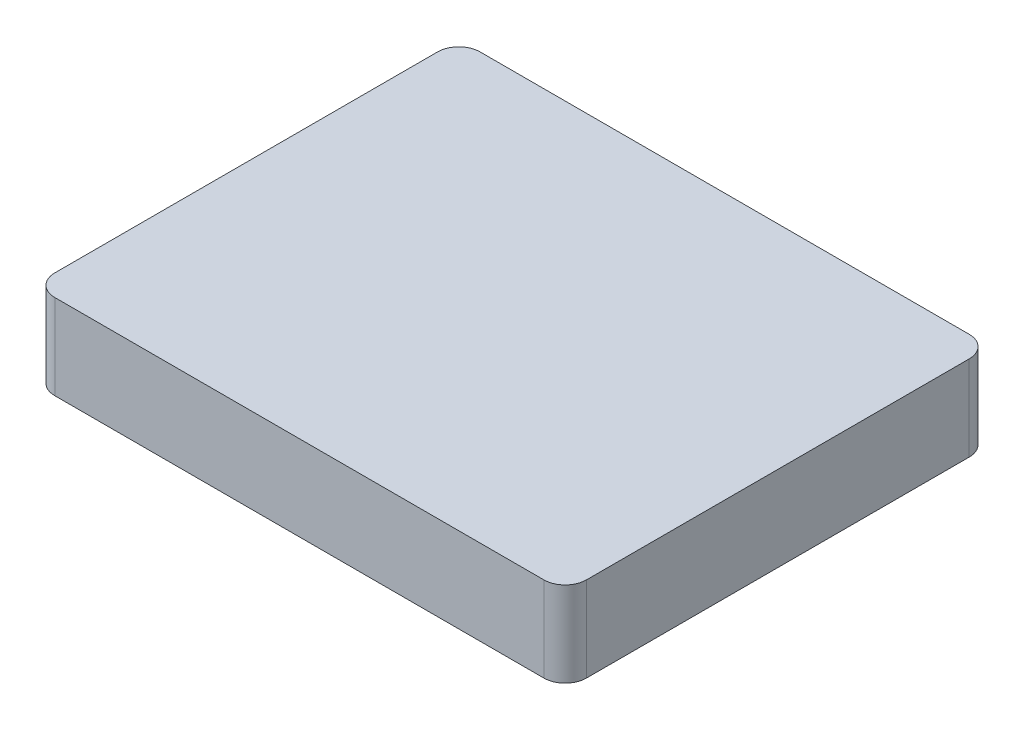
ISO-10303-21;
HEADER;
FILE_DESCRIPTION(('STEP AP214'),'2;1');
FILE_NAME('part.step','',(''),(''),'','','');
FILE_SCHEMA(('AUTOMOTIVE_DESIGN { 1 0 10303 214 1 1 1 1 }'));
ENDSEC;
DATA;
#1=APPLICATION_CONTEXT('core data for automotive mechanical design processes');
#2=APPLICATION_PROTOCOL_DEFINITION('international standard','automotive_design',2000,#1);
#3=PRODUCT_CONTEXT('',#1,'mechanical');
#4=PRODUCT('Part','Part','',(#3));
#5=PRODUCT_RELATED_PRODUCT_CATEGORY('part','',(#4));
#6=PRODUCT_DEFINITION_FORMATION('','',#4);
#7=PRODUCT_DEFINITION_CONTEXT('part definition',#1,'design');
#8=PRODUCT_DEFINITION('design','',#6,#7);
#9=PRODUCT_DEFINITION_SHAPE('','',#8);
#10=(LENGTH_UNIT() NAMED_UNIT(*) SI_UNIT(.MILLI.,.METRE.));
#11=(NAMED_UNIT(*) PLANE_ANGLE_UNIT() SI_UNIT($,.RADIAN.));
#12=(NAMED_UNIT(*) SI_UNIT($,.STERADIAN.) SOLID_ANGLE_UNIT());
#13=UNCERTAINTY_MEASURE_WITH_UNIT(LENGTH_MEASURE(1.E-05),#10,'distance_accuracy_value','');
#14=(GEOMETRIC_REPRESENTATION_CONTEXT(3) GLOBAL_UNCERTAINTY_ASSIGNED_CONTEXT((#13)) GLOBAL_UNIT_ASSIGNED_CONTEXT((#10,
#11,#12)) REPRESENTATION_CONTEXT('',''));
#15=CARTESIAN_POINT('',(0.,0.,0.));
#16=DIRECTION('',(0.,0.,1.));
#17=DIRECTION('',(1.,0.,0.));
#18=AXIS2_PLACEMENT_3D('',#15,#16,#17);
#19=CARTESIAN_POINT('',(0.,2.54,-12.7));
#20=DIRECTION('',(1.,0.,0.));
#21=DIRECTION('',(0.,0.,-1.));
#22=AXIS2_PLACEMENT_3D('',#19,#20,#21);
#23=PLANE('',#22);
#24=DIRECTION('',(0.,0.,1.));
#25=VECTOR('',#24,1.);
#26=CARTESIAN_POINT('',(0.,2.54,-12.7));
#27=LINE('',#26,#25);
#28=CARTESIAN_POINT('',(0.,2.54,-12.065));
#29=VERTEX_POINT('',#28);
#30=CARTESIAN_POINT('',(0.,2.54,-0.635));
#31=VERTEX_POINT('',#30);
#32=EDGE_CURVE('E161',#29,#31,#27,.T.);
#33=ORIENTED_EDGE('',*,*,#32,.F.);
#34=DIRECTION('',(0.,-1.,0.));
#35=VECTOR('',#34,1.);
#36=CARTESIAN_POINT('',(0.,2.54,-12.065));
#37=LINE('',#36,#35);
#38=CARTESIAN_POINT('',(0.,0.,-12.065));
#39=VERTEX_POINT('',#38);
#40=EDGE_CURVE('E186',#29,#39,#37,.T.);
#41=ORIENTED_EDGE('',*,*,#40,.T.);
#42=DIRECTION('',(0.,0.,1.));
#43=VECTOR('',#42,1.);
#44=CARTESIAN_POINT('',(0.,0.,-12.7));
#45=LINE('',#44,#43);
#46=CARTESIAN_POINT('',(0.,0.,-0.635));
#47=VERTEX_POINT('',#46);
#48=EDGE_CURVE('E174',#39,#47,#45,.T.);
#49=ORIENTED_EDGE('',*,*,#48,.T.);
#50=DIRECTION('',(0.,-1.,0.));
#51=VECTOR('',#50,1.);
#52=CARTESIAN_POINT('',(0.,2.54,-0.635));
#53=LINE('',#52,#51);
#54=EDGE_CURVE('E173',#47,#31,#53,.F.);
#55=ORIENTED_EDGE('',*,*,#54,.T.);
#56=EDGE_LOOP('',(#33,#41,#49,#55));
#57=FACE_BOUND('',#56,.T.);
#58=ADVANCED_FACE('F32',(#57),#23,.F.);
#59=CARTESIAN_POINT('',(0.,2.54,0.));
#60=DIRECTION('',(0.,0.,-1.));
#61=DIRECTION('',(-1.,0.,0.));
#62=AXIS2_PLACEMENT_3D('',#59,#60,#61);
#63=PLANE('',#62);
#64=DIRECTION('',(1.,0.,0.));
#65=VECTOR('',#64,1.);
#66=CARTESIAN_POINT('',(0.,0.,0.));
#67=LINE('',#66,#65);
#68=CARTESIAN_POINT('',(0.635,0.,0.));
#69=VERTEX_POINT('',#68);
#70=CARTESIAN_POINT('',(15.24,0.,0.));
#71=VERTEX_POINT('',#70);
#72=EDGE_CURVE('E177',#69,#71,#67,.T.);
#73=ORIENTED_EDGE('',*,*,#72,.T.);
#74=DIRECTION('',(0.,-1.,0.));
#75=VECTOR('',#74,1.);
#76=CARTESIAN_POINT('',(15.24,2.54,0.));
#77=LINE('',#76,#75);
#78=CARTESIAN_POINT('',(15.24,2.54,0.));
#79=VERTEX_POINT('',#78);
#80=EDGE_CURVE('E40',#71,#79,#77,.F.);
#81=ORIENTED_EDGE('',*,*,#80,.T.);
#82=DIRECTION('',(1.,0.,0.));
#83=VECTOR('',#82,1.);
#84=CARTESIAN_POINT('',(0.,2.54,0.));
#85=LINE('',#84,#83);
#86=CARTESIAN_POINT('',(0.635,2.54,0.));
#87=VERTEX_POINT('',#86);
#88=EDGE_CURVE('E164',#87,#79,#85,.T.);
#89=ORIENTED_EDGE('',*,*,#88,.F.);
#90=DIRECTION('',(0.,-1.,0.));
#91=VECTOR('',#90,1.);
#92=CARTESIAN_POINT('',(0.635,2.54,0.));
#93=LINE('',#92,#91);
#94=EDGE_CURVE('E214',#87,#69,#93,.T.);
#95=ORIENTED_EDGE('',*,*,#94,.T.);
#96=EDGE_LOOP('',(#73,#81,#89,#95));
#97=FACE_BOUND('',#96,.T.);
#98=ADVANCED_FACE('F219',(#97),#63,.F.);
#99=CARTESIAN_POINT('',(15.875,2.54,0.));
#100=DIRECTION('',(-1.,0.,0.));
#101=DIRECTION('',(0.,0.,1.));
#102=AXIS2_PLACEMENT_3D('',#99,#100,#101);
#103=PLANE('',#102);
#104=DIRECTION('',(0.,0.,-1.));
#105=VECTOR('',#104,1.);
#106=CARTESIAN_POINT('',(15.875,0.,0.));
#107=LINE('',#106,#105);
#108=CARTESIAN_POINT('',(15.875,0.,-0.635));
#109=VERTEX_POINT('',#108);
#110=CARTESIAN_POINT('',(15.875,0.,-12.065));
#111=VERTEX_POINT('',#110);
#112=EDGE_CURVE('E181',#109,#111,#107,.T.);
#113=ORIENTED_EDGE('',*,*,#112,.T.);
#114=DIRECTION('',(0.,-1.,0.));
#115=VECTOR('',#114,1.);
#116=CARTESIAN_POINT('',(15.875,2.54,-12.065));
#117=LINE('',#116,#115);
#118=CARTESIAN_POINT('',(15.875,2.54,-12.065));
#119=VERTEX_POINT('',#118);
#120=EDGE_CURVE('E55',#111,#119,#117,.F.);
#121=ORIENTED_EDGE('',*,*,#120,.T.);
#122=DIRECTION('',(0.,0.,-1.));
#123=VECTOR('',#122,1.);
#124=CARTESIAN_POINT('',(15.875,2.54,0.));
#125=LINE('',#124,#123);
#126=CARTESIAN_POINT('',(15.875,2.54,-0.635));
#127=VERTEX_POINT('',#126);
#128=EDGE_CURVE('E168',#127,#119,#125,.T.);
#129=ORIENTED_EDGE('',*,*,#128,.F.);
#130=DIRECTION('',(0.,-1.,0.));
#131=VECTOR('',#130,1.);
#132=CARTESIAN_POINT('',(15.875,2.54,-0.635));
#133=LINE('',#132,#131);
#134=EDGE_CURVE('E210',#127,#109,#133,.T.);
#135=ORIENTED_EDGE('',*,*,#134,.T.);
#136=EDGE_LOOP('',(#113,#121,#129,#135));
#137=FACE_BOUND('',#136,.T.);
#138=ADVANCED_FACE('F230',(#137),#103,.F.);
#139=CARTESIAN_POINT('',(15.875,2.54,-12.7));
#140=DIRECTION('',(0.,0.,1.));
#141=DIRECTION('',(1.,0.,0.));
#142=AXIS2_PLACEMENT_3D('',#139,#140,#141);
#143=PLANE('',#142);
#144=DIRECTION('',(-1.,0.,0.));
#145=VECTOR('',#144,1.);
#146=CARTESIAN_POINT('',(15.875,0.,-12.7));
#147=LINE('',#146,#145);
#148=CARTESIAN_POINT('',(15.24,0.,-12.7));
#149=VERTEX_POINT('',#148);
#150=CARTESIAN_POINT('',(0.634999999999993,0.,-12.7));
#151=VERTEX_POINT('',#150);
#152=EDGE_CURVE('E165',#149,#151,#147,.T.);
#153=ORIENTED_EDGE('',*,*,#152,.T.);
#154=DIRECTION('',(0.,-1.,0.));
#155=VECTOR('',#154,1.);
#156=CARTESIAN_POINT('',(0.634999999999993,2.54,-12.7));
#157=LINE('',#156,#155);
#158=CARTESIAN_POINT('',(0.634999999999993,2.54,-12.7));
#159=VERTEX_POINT('',#158);
#160=EDGE_CURVE('E200',#151,#159,#157,.F.);
#161=ORIENTED_EDGE('',*,*,#160,.T.);
#162=DIRECTION('',(-1.,0.,0.));
#163=VECTOR('',#162,1.);
#164=CARTESIAN_POINT('',(15.875,2.54,-12.7));
#165=LINE('',#164,#163);
#166=CARTESIAN_POINT('',(15.24,2.54,-12.7));
#167=VERTEX_POINT('',#166);
#168=EDGE_CURVE('E170',#167,#159,#165,.T.);
#169=ORIENTED_EDGE('',*,*,#168,.F.);
#170=DIRECTION('',(0.,-1.,0.));
#171=VECTOR('',#170,1.);
#172=CARTESIAN_POINT('',(15.24,2.54,-12.7));
#173=LINE('',#172,#171);
#174=EDGE_CURVE('E197',#167,#149,#173,.T.);
#175=ORIENTED_EDGE('',*,*,#174,.T.);
#176=EDGE_LOOP('',(#153,#161,#169,#175));
#177=FACE_BOUND('',#176,.T.);
#178=ADVANCED_FACE('F241',(#177),#143,.F.);
#179=CARTESIAN_POINT('',(0.,2.54,0.));
#180=DIRECTION('',(0.,1.,0.));
#181=DIRECTION('',(0.,0.,1.));
#182=AXIS2_PLACEMENT_3D('',#179,#180,#181);
#183=PLANE('',#182);
#184=ORIENTED_EDGE('',*,*,#168,.T.);
#185=CARTESIAN_POINT('',(0.634999999999993,2.54,-12.065));
#186=DIRECTION('',(0.,1.,0.));
#187=DIRECTION('',(0.,0.,1.));
#188=AXIS2_PLACEMENT_3D('',#185,#186,#187);
#189=CIRCLE('',#188,0.635);
#190=EDGE_CURVE('E208',#159,#29,#189,.T.);
#191=ORIENTED_EDGE('',*,*,#190,.T.);
#192=ORIENTED_EDGE('',*,*,#32,.T.);
#193=CARTESIAN_POINT('',(0.635,2.54,-0.635));
#194=DIRECTION('',(0.,1.,0.));
#195=DIRECTION('',(0.,0.,1.));
#196=AXIS2_PLACEMENT_3D('',#193,#194,#195);
#197=CIRCLE('',#196,0.635);
#198=EDGE_CURVE('E202',#31,#87,#197,.T.);
#199=ORIENTED_EDGE('',*,*,#198,.T.);
#200=ORIENTED_EDGE('',*,*,#88,.T.);
#201=CARTESIAN_POINT('',(15.24,2.54,-0.635));
#202=DIRECTION('',(0.,1.,0.));
#203=DIRECTION('',(0.,0.,1.));
#204=AXIS2_PLACEMENT_3D('',#201,#202,#203);
#205=CIRCLE('',#204,0.635);
#206=EDGE_CURVE('E204',#79,#127,#205,.T.);
#207=ORIENTED_EDGE('',*,*,#206,.T.);
#208=ORIENTED_EDGE('',*,*,#128,.T.);
#209=CARTESIAN_POINT('',(15.24,2.54,-12.065));
#210=DIRECTION('',(0.,1.,0.));
#211=DIRECTION('',(0.,0.,1.));
#212=AXIS2_PLACEMENT_3D('',#209,#210,#211);
#213=CIRCLE('',#212,0.635);
#214=EDGE_CURVE('E206',#119,#167,#213,.T.);
#215=ORIENTED_EDGE('',*,*,#214,.T.);
#216=EDGE_LOOP('',(#184,#191,#192,#199,#200,#207,#208,#215));
#217=FACE_BOUND('',#216,.T.);
#218=ADVANCED_FACE('F225',(#217),#183,.T.);
#219=CARTESIAN_POINT('',(0.,0.,0.));
#220=DIRECTION('',(0.,1.,0.));
#221=DIRECTION('',(0.,0.,1.));
#222=AXIS2_PLACEMENT_3D('',#219,#220,#221);
#223=PLANE('',#222);
#224=DIRECTION('',(-1.,0.,0.));
#225=VECTOR('',#224,1.);
#226=CARTESIAN_POINT('',(15.875,0.,-12.065));
#227=LINE('',#226,#225);
#228=CARTESIAN_POINT('',(15.24,0.,-12.065));
#229=VERTEX_POINT('',#228);
#230=CARTESIAN_POINT('',(0.634999999999993,0.,-12.065));
#231=VERTEX_POINT('',#230);
#232=EDGE_CURVE('E133',#229,#231,#227,.T.);
#233=ORIENTED_EDGE('',*,*,#232,.T.);
#234=DIRECTION('',(0.,0.,1.));
#235=VECTOR('',#234,1.);
#236=CARTESIAN_POINT('',(0.634999999999993,0.,-12.7));
#237=LINE('',#236,#235);
#238=CARTESIAN_POINT('',(0.635,0.,-0.635));
#239=VERTEX_POINT('',#238);
#240=EDGE_CURVE('E139',#231,#239,#237,.T.);
#241=ORIENTED_EDGE('',*,*,#240,.T.);
#242=DIRECTION('',(1.,0.,0.));
#243=VECTOR('',#242,1.);
#244=CARTESIAN_POINT('',(0.,0.,-0.635));
#245=LINE('',#244,#243);
#246=CARTESIAN_POINT('',(15.24,0.,-0.635));
#247=VERTEX_POINT('',#246);
#248=EDGE_CURVE('E155',#239,#247,#245,.T.);
#249=ORIENTED_EDGE('',*,*,#248,.T.);
#250=DIRECTION('',(0.,0.,-1.));
#251=VECTOR('',#250,1.);
#252=CARTESIAN_POINT('',(15.24,0.,0.));
#253=LINE('',#252,#251);
#254=EDGE_CURVE('E47',#247,#229,#253,.T.);
#255=ORIENTED_EDGE('',*,*,#254,.T.);
#256=EDGE_LOOP('',(#233,#241,#249,#255));
#257=FACE_BOUND('',#256,.T.);
#258=ORIENTED_EDGE('',*,*,#48,.F.);
#259=CARTESIAN_POINT('',(0.634999999999993,0.,-12.065));
#260=DIRECTION('',(0.,1.,0.));
#261=DIRECTION('',(0.,0.,1.));
#262=AXIS2_PLACEMENT_3D('',#259,#260,#261);
#263=CIRCLE('',#262,0.635);
#264=EDGE_CURVE('E195',#39,#151,#263,.F.);
#265=ORIENTED_EDGE('',*,*,#264,.T.);
#266=ORIENTED_EDGE('',*,*,#152,.F.);
#267=CARTESIAN_POINT('',(15.24,0.,-12.065));
#268=DIRECTION('',(0.,1.,0.));
#269=DIRECTION('',(0.,0.,1.));
#270=AXIS2_PLACEMENT_3D('',#267,#268,#269);
#271=CIRCLE('',#270,0.635);
#272=EDGE_CURVE('E193',#149,#111,#271,.F.);
#273=ORIENTED_EDGE('',*,*,#272,.T.);
#274=ORIENTED_EDGE('',*,*,#112,.F.);
#275=CARTESIAN_POINT('',(15.24,0.,-0.635));
#276=DIRECTION('',(0.,1.,0.));
#277=DIRECTION('',(0.,0.,1.));
#278=AXIS2_PLACEMENT_3D('',#275,#276,#277);
#279=CIRCLE('',#278,0.635);
#280=EDGE_CURVE('E191',#109,#71,#279,.F.);
#281=ORIENTED_EDGE('',*,*,#280,.T.);
#282=ORIENTED_EDGE('',*,*,#72,.F.);
#283=CARTESIAN_POINT('',(0.635,0.,-0.635));
#284=DIRECTION('',(0.,1.,0.));
#285=DIRECTION('',(0.,0.,1.));
#286=AXIS2_PLACEMENT_3D('',#283,#284,#285);
#287=CIRCLE('',#286,0.635);
#288=EDGE_CURVE('E189',#69,#47,#287,.F.);
#289=ORIENTED_EDGE('',*,*,#288,.T.);
#290=EDGE_LOOP('',(#258,#265,#266,#273,#274,#281,#282,#289));
#291=FACE_BOUND('',#290,.T.);
#292=ADVANCED_FACE('F233',(#257,#291),#223,.F.);
#293=CARTESIAN_POINT('',(0.634999999999993,2.54,-12.065));
#294=DIRECTION('',(0.,-1.,0.));
#295=DIRECTION('',(0.,0.,-1.));
#296=AXIS2_PLACEMENT_3D('',#293,#294,#295);
#297=CYLINDRICAL_SURFACE('',#296,0.635);
#298=ORIENTED_EDGE('',*,*,#190,.F.);
#299=ORIENTED_EDGE('',*,*,#160,.F.);
#300=ORIENTED_EDGE('',*,*,#264,.F.);
#301=ORIENTED_EDGE('',*,*,#40,.F.);
#302=EDGE_LOOP('',(#298,#299,#300,#301));
#303=FACE_BOUND('',#302,.T.);
#304=ADVANCED_FACE('F247',(#303),#297,.T.);
#305=CARTESIAN_POINT('',(15.24,2.54,-12.065));
#306=DIRECTION('',(0.,-1.,0.));
#307=DIRECTION('',(0.,0.,-1.));
#308=AXIS2_PLACEMENT_3D('',#305,#306,#307);
#309=CYLINDRICAL_SURFACE('',#308,0.635);
#310=ORIENTED_EDGE('',*,*,#214,.F.);
#311=ORIENTED_EDGE('',*,*,#120,.F.);
#312=ORIENTED_EDGE('',*,*,#272,.F.);
#313=ORIENTED_EDGE('',*,*,#174,.F.);
#314=EDGE_LOOP('',(#310,#311,#312,#313));
#315=FACE_BOUND('',#314,.T.);
#316=ADVANCED_FACE('F238',(#315),#309,.T.);
#317=CARTESIAN_POINT('',(15.24,2.54,-0.635));
#318=DIRECTION('',(0.,-1.,0.));
#319=DIRECTION('',(0.,0.,-1.));
#320=AXIS2_PLACEMENT_3D('',#317,#318,#319);
#321=CYLINDRICAL_SURFACE('',#320,0.635);
#322=ORIENTED_EDGE('',*,*,#206,.F.);
#323=ORIENTED_EDGE('',*,*,#80,.F.);
#324=ORIENTED_EDGE('',*,*,#280,.F.);
#325=ORIENTED_EDGE('',*,*,#134,.F.);
#326=EDGE_LOOP('',(#322,#323,#324,#325));
#327=FACE_BOUND('',#326,.T.);
#328=ADVANCED_FACE('F228',(#327),#321,.T.);
#329=CARTESIAN_POINT('',(0.635,2.54,-0.635));
#330=DIRECTION('',(0.,-1.,0.));
#331=DIRECTION('',(0.,0.,-1.));
#332=AXIS2_PLACEMENT_3D('',#329,#330,#331);
#333=CYLINDRICAL_SURFACE('',#332,0.635);
#334=ORIENTED_EDGE('',*,*,#198,.F.);
#335=ORIENTED_EDGE('',*,*,#54,.F.);
#336=ORIENTED_EDGE('',*,*,#288,.F.);
#337=ORIENTED_EDGE('',*,*,#94,.F.);
#338=EDGE_LOOP('',(#334,#335,#336,#337));
#339=FACE_BOUND('',#338,.T.);
#340=ADVANCED_FACE('F34',(#339),#333,.T.);
#341=CARTESIAN_POINT('',(0.634999999999993,2.54,-12.7));
#342=DIRECTION('',(1.,0.,0.));
#343=DIRECTION('',(0.,0.,-1.));
#344=AXIS2_PLACEMENT_3D('',#341,#342,#343);
#345=PLANE('',#344);
#346=DIRECTION('',(0.,0.,1.));
#347=VECTOR('',#346,1.);
#348=CARTESIAN_POINT('',(0.634999999999993,1.905,-12.7));
#349=LINE('',#348,#347);
#350=CARTESIAN_POINT('',(0.634999999999993,1.905,-12.065));
#351=VERTEX_POINT('',#350);
#352=CARTESIAN_POINT('',(0.635,1.905,-0.635));
#353=VERTEX_POINT('',#352);
#354=EDGE_CURVE('E123',#351,#353,#349,.T.);
#355=ORIENTED_EDGE('',*,*,#354,.T.);
#356=DIRECTION('',(0.,1.,0.));
#357=VECTOR('',#356,1.);
#358=CARTESIAN_POINT('',(0.635,2.54,-0.635));
#359=LINE('',#358,#357);
#360=EDGE_CURVE('E144',#239,#353,#359,.T.);
#361=ORIENTED_EDGE('',*,*,#360,.F.);
#362=ORIENTED_EDGE('',*,*,#240,.F.);
#363=DIRECTION('',(0.,1.,0.));
#364=VECTOR('',#363,1.);
#365=CARTESIAN_POINT('',(0.634999999999993,2.54,-12.065));
#366=LINE('',#365,#364);
#367=EDGE_CURVE('E136',#231,#351,#366,.T.);
#368=ORIENTED_EDGE('',*,*,#367,.T.);
#369=EDGE_LOOP('',(#355,#361,#362,#368));
#370=FACE_BOUND('',#369,.T.);
#371=ADVANCED_FACE('F137',(#370),#345,.T.);
#372=CARTESIAN_POINT('',(0.,2.54,-0.635));
#373=DIRECTION('',(0.,0.,-1.));
#374=DIRECTION('',(-1.,0.,0.));
#375=AXIS2_PLACEMENT_3D('',#372,#373,#374);
#376=PLANE('',#375);
#377=ORIENTED_EDGE('',*,*,#248,.F.);
#378=ORIENTED_EDGE('',*,*,#360,.T.);
#379=DIRECTION('',(1.,0.,0.));
#380=VECTOR('',#379,1.);
#381=CARTESIAN_POINT('',(0.,1.905,-0.635));
#382=LINE('',#381,#380);
#383=CARTESIAN_POINT('',(15.24,1.905,-0.635));
#384=VERTEX_POINT('',#383);
#385=EDGE_CURVE('E130',#353,#384,#382,.T.);
#386=ORIENTED_EDGE('',*,*,#385,.T.);
#387=DIRECTION('',(0.,1.,0.));
#388=VECTOR('',#387,1.);
#389=CARTESIAN_POINT('',(15.24,2.54,-0.635));
#390=LINE('',#389,#388);
#391=EDGE_CURVE('E178',#247,#384,#390,.T.);
#392=ORIENTED_EDGE('',*,*,#391,.F.);
#393=EDGE_LOOP('',(#377,#378,#386,#392));
#394=FACE_BOUND('',#393,.T.);
#395=ADVANCED_FACE('F256',(#394),#376,.T.);
#396=CARTESIAN_POINT('',(15.24,2.54,0.));
#397=DIRECTION('',(-1.,0.,0.));
#398=DIRECTION('',(0.,0.,1.));
#399=AXIS2_PLACEMENT_3D('',#396,#397,#398);
#400=PLANE('',#399);
#401=ORIENTED_EDGE('',*,*,#254,.F.);
#402=ORIENTED_EDGE('',*,*,#391,.T.);
#403=DIRECTION('',(0.,0.,-1.));
#404=VECTOR('',#403,1.);
#405=CARTESIAN_POINT('',(15.24,1.905,0.));
#406=LINE('',#405,#404);
#407=CARTESIAN_POINT('',(15.24,1.905,-12.065));
#408=VERTEX_POINT('',#407);
#409=EDGE_CURVE('E148',#384,#408,#406,.T.);
#410=ORIENTED_EDGE('',*,*,#409,.T.);
#411=DIRECTION('',(0.,1.,0.));
#412=VECTOR('',#411,1.);
#413=CARTESIAN_POINT('',(15.24,2.54,-12.065));
#414=LINE('',#413,#412);
#415=EDGE_CURVE('E143',#229,#408,#414,.T.);
#416=ORIENTED_EDGE('',*,*,#415,.F.);
#417=EDGE_LOOP('',(#401,#402,#410,#416));
#418=FACE_BOUND('',#417,.T.);
#419=ADVANCED_FACE('F308',(#418),#400,.T.);
#420=CARTESIAN_POINT('',(15.875,2.54,-12.065));
#421=DIRECTION('',(0.,0.,1.));
#422=DIRECTION('',(1.,0.,0.));
#423=AXIS2_PLACEMENT_3D('',#420,#421,#422);
#424=PLANE('',#423);
#425=ORIENTED_EDGE('',*,*,#232,.F.);
#426=ORIENTED_EDGE('',*,*,#415,.T.);
#427=DIRECTION('',(-1.,0.,0.));
#428=VECTOR('',#427,1.);
#429=CARTESIAN_POINT('',(15.875,1.905,-12.065));
#430=LINE('',#429,#428);
#431=EDGE_CURVE('E127',#408,#351,#430,.T.);
#432=ORIENTED_EDGE('',*,*,#431,.T.);
#433=ORIENTED_EDGE('',*,*,#367,.F.);
#434=EDGE_LOOP('',(#425,#426,#432,#433));
#435=FACE_BOUND('',#434,.T.);
#436=ADVANCED_FACE('F146',(#435),#424,.T.);
#437=CARTESIAN_POINT('',(0.,1.905,0.));
#438=DIRECTION('',(0.,1.,0.));
#439=DIRECTION('',(0.,0.,1.));
#440=AXIS2_PLACEMENT_3D('',#437,#438,#439);
#441=PLANE('',#440);
#442=CARTESIAN_POINT('',(7.93749999999999,1.905,-6.35));
#443=DIRECTION('',(0.,1.,0.));
#444=DIRECTION('',(0.,0.,1.));
#445=AXIS2_PLACEMENT_3D('',#442,#443,#444);
#446=CIRCLE('',#445,2.54);
#447=CARTESIAN_POINT('',(7.93749999999999,1.905,-3.81));
#448=VERTEX_POINT('',#447);
#449=EDGE_CURVE('E11',#448,#448,#446,.F.);
#450=ORIENTED_EDGE('',*,*,#449,.F.);
#451=EDGE_LOOP('',(#450));
#452=FACE_BOUND('',#451,.T.);
#453=ORIENTED_EDGE('',*,*,#431,.F.);
#454=ORIENTED_EDGE('',*,*,#409,.F.);
#455=ORIENTED_EDGE('',*,*,#385,.F.);
#456=ORIENTED_EDGE('',*,*,#354,.F.);
#457=EDGE_LOOP('',(#453,#454,#455,#456));
#458=FACE_BOUND('',#457,.T.);
#459=ADVANCED_FACE('F125',(#452,#458),#441,.F.);
#460=CARTESIAN_POINT('',(7.93749999999999,-7.18420489685532,-6.35));
#461=DIRECTION('',(0.,1.,0.));
#462=DIRECTION('',(0.,0.,1.));
#463=AXIS2_PLACEMENT_3D('',#460,#461,#462);
#464=CYLINDRICAL_SURFACE('',#463,2.54);
#465=CARTESIAN_POINT('',(7.93749999999999,0.,-6.35));
#466=DIRECTION('',(0.,1.,0.));
#467=DIRECTION('',(0.,0.,1.));
#468=AXIS2_PLACEMENT_3D('',#465,#466,#467);
#469=CIRCLE('',#468,2.54);
#470=CARTESIAN_POINT('',(7.93749999999999,0.,-3.81));
#471=VERTEX_POINT('',#470);
#472=EDGE_CURVE('E156',#471,#471,#469,.T.);
#473=CARTESIAN_POINT('',(7.93749999999999,0.,-3.81));
#474=CARTESIAN_POINT('',(7.93749999999999,0.0198437499999991,-3.81));
#475=CARTESIAN_POINT('',(7.93749999999999,0.0396874999999989,-3.81));
#476=CARTESIAN_POINT('',(7.93749999999999,0.079374999999999,-3.81));
#477=CARTESIAN_POINT('',(7.93749999999999,0.0992187499999992,-3.81));
#478=CARTESIAN_POINT('',(7.93749999999999,0.138906249999999,-3.81));
#479=CARTESIAN_POINT('',(7.93749999999999,0.158749999999999,-3.81));
#480=CARTESIAN_POINT('',(7.93749999999999,0.198437499999999,-3.81));
#481=CARTESIAN_POINT('',(7.93749999999999,0.218281249999999,-3.81));
#482=CARTESIAN_POINT('',(7.93749999999999,0.25796875,-3.81));
#483=CARTESIAN_POINT('',(7.93749999999999,0.277812499999999,-3.81));
#484=CARTESIAN_POINT('',(7.93749999999999,0.317499999999999,-3.81));
#485=CARTESIAN_POINT('',(7.93749999999999,0.337343749999999,-3.81));
#486=CARTESIAN_POINT('',(7.93749999999999,0.377031249999999,-3.81));
#487=CARTESIAN_POINT('',(7.93749999999999,0.396874999999999,-3.81));
#488=CARTESIAN_POINT('',(7.93749999999999,0.436562499999999,-3.81));
#489=CARTESIAN_POINT('',(7.93749999999999,0.456406249999999,-3.81));
#490=CARTESIAN_POINT('',(7.93749999999999,0.496093749999999,-3.81));
#491=CARTESIAN_POINT('',(7.93749999999999,0.515937499999999,-3.81));
#492=CARTESIAN_POINT('',(7.93749999999999,0.555624999999999,-3.81));
#493=CARTESIAN_POINT('',(7.93749999999999,0.575468749999999,-3.81));
#494=CARTESIAN_POINT('',(7.93749999999999,0.615156249999999,-3.81));
#495=CARTESIAN_POINT('',(7.93749999999999,0.634999999999999,-3.81));
#496=CARTESIAN_POINT('',(7.93749999999999,0.674687499999998,-3.81));
#497=CARTESIAN_POINT('',(7.93749999999999,0.694531249999998,-3.81));
#498=CARTESIAN_POINT('',(7.93749999999999,0.734218749999998,-3.81));
#499=CARTESIAN_POINT('',(7.93749999999999,0.754062499999998,-3.81));
#500=CARTESIAN_POINT('',(7.93749999999999,0.793749999999998,-3.81));
#501=CARTESIAN_POINT('',(7.93749999999999,0.813593749999999,-3.81));
#502=CARTESIAN_POINT('',(7.93749999999999,0.853281249999999,-3.81));
#503=CARTESIAN_POINT('',(7.93749999999999,0.873124999999999,-3.81));
#504=CARTESIAN_POINT('',(7.93749999999999,0.912812499999999,-3.81));
#505=CARTESIAN_POINT('',(7.93749999999999,0.932656249999999,-3.81));
#506=CARTESIAN_POINT('',(7.93749999999999,0.972343749999998,-3.81));
#507=CARTESIAN_POINT('',(7.93749999999999,0.992187499999998,-3.81));
#508=CARTESIAN_POINT('',(7.93749999999999,1.031875,-3.81));
#509=CARTESIAN_POINT('',(7.93749999999999,1.05171875,-3.81));
#510=CARTESIAN_POINT('',(7.93749999999999,1.09140625,-3.81));
#511=CARTESIAN_POINT('',(7.93749999999999,1.11125,-3.81));
#512=CARTESIAN_POINT('',(7.93749999999999,1.1509375,-3.81));
#513=CARTESIAN_POINT('',(7.93749999999999,1.17078125,-3.81));
#514=CARTESIAN_POINT('',(7.93749999999999,1.21046875,-3.81));
#515=CARTESIAN_POINT('',(7.93749999999999,1.2303125,-3.81));
#516=CARTESIAN_POINT('',(7.93749999999999,1.27,-3.81));
#517=CARTESIAN_POINT('',(7.93749999999999,1.28984375,-3.81));
#518=CARTESIAN_POINT('',(7.93749999999999,1.32953125,-3.81));
#519=CARTESIAN_POINT('',(7.93749999999999,1.349375,-3.81));
#520=CARTESIAN_POINT('',(7.93749999999999,1.3890625,-3.81));
#521=CARTESIAN_POINT('',(7.93749999999999,1.40890625,-3.81));
#522=CARTESIAN_POINT('',(7.93749999999999,1.44859375,-3.81));
#523=CARTESIAN_POINT('',(7.93749999999999,1.4684375,-3.81));
#524=CARTESIAN_POINT('',(7.93749999999999,1.508125,-3.81));
#525=CARTESIAN_POINT('',(7.93749999999999,1.52796875,-3.81));
#526=CARTESIAN_POINT('',(7.93749999999999,1.56765625,-3.81));
#527=CARTESIAN_POINT('',(7.93749999999999,1.5875,-3.81));
#528=CARTESIAN_POINT('',(7.93749999999999,1.6271875,-3.81));
#529=CARTESIAN_POINT('',(7.93749999999999,1.64703125,-3.81));
#530=CARTESIAN_POINT('',(7.93749999999999,1.68671875,-3.81));
#531=CARTESIAN_POINT('',(7.93749999999999,1.7065625,-3.81));
#532=CARTESIAN_POINT('',(7.93749999999999,1.74625,-3.81));
#533=CARTESIAN_POINT('',(7.93749999999999,1.76609375,-3.81));
#534=CARTESIAN_POINT('',(7.93749999999999,1.80578125,-3.81));
#535=CARTESIAN_POINT('',(7.93749999999999,1.825625,-3.81));
#536=CARTESIAN_POINT('',(7.93749999999999,1.8653125,-3.81));
#537=CARTESIAN_POINT('',(7.93749999999999,1.88515625,-3.81));
#538=CARTESIAN_POINT('',(7.93749999999999,1.905,-3.81));
#539=B_SPLINE_CURVE_WITH_KNOTS('',3,(#473,#474,#475,#476,#477,#478,#479,#480,#481,#482,#483,
#484,#485,#486,#487,#488,#489,#490,#491,#492,#493,#494,#495,#496,#497,#498,#499,#500,#501,#502,
#503,#504,#505,#506,#507,#508,#509,#510,#511,#512,#513,#514,#515,#516,#517,#518,#519,#520,#521,
#522,#523,#524,#525,#526,#527,#528,#529,#530,#531,#532,#533,#534,#535,#536,#537,#538),
.UNSPECIFIED.,.F.,.F.,(4,2,2,2,2,2,2,2,2,2,2,2,2,2,2,2,2,2,2,2,2,2,2,2,2,2,2,2,2,2,2,2,4),(0.,
0.0595312499999997,0.1190625,0.17859375,0.238125,0.29765625,0.3571875,0.41671875,0.47625,
0.53578125,0.5953125,0.654843749999999,0.714374999999999,0.773906249999999,0.8334375,0.89296875,
0.952499999999999,1.01203125,1.0715625,1.13109375,1.190625,1.25015625,1.3096875,1.36921875,
1.42875,1.48828125,1.5478125,1.60734375,1.666875,1.72640625,1.7859375,1.84546875,1.905),.UNSPECIFIED.);
#540=EDGE_CURVE('BSEAM334',#471,#448,#539,.T.);
#541=ORIENTED_EDGE('',*,*,#472,.T.);
#542=ORIENTED_EDGE('',*,*,#449,.T.);
#543=ORIENTED_EDGE('',*,*,#540,.T.);
#544=ORIENTED_EDGE('',*,*,#540,.F.);
#545=EDGE_LOOP('',(#541,#543,#542,#544));
#546=FACE_BOUND('',#545,.T.);
#547=ADVANCED_FACE('F334',(#546),#464,.T.);
#548=CARTESIAN_POINT('',(0.,0.,0.));
#549=DIRECTION('',(0.,1.,0.));
#550=DIRECTION('',(0.,0.,1.));
#551=AXIS2_PLACEMENT_3D('',#548,#549,#550);
#552=PLANE('',#551);
#553=ORIENTED_EDGE('',*,*,#472,.F.);
#554=EDGE_LOOP('',(#553));
#555=FACE_BOUND('',#554,.T.);
#556=ADVANCED_FACE('F344',(#555),#552,.F.);
#557=CLOSED_SHELL('',(#58,#98,#138,#178,#218,#292,#304,#316,#328,#340,#371,#395,#419,#436,#459,
#547,#556));
#558=MANIFOLD_SOLID_BREP('B2',#557);
#559=ADVANCED_BREP_SHAPE_REPRESENTATION('',(#18,#558),#14);
#560=SHAPE_DEFINITION_REPRESENTATION(#9,#559);
ENDSEC;
END-ISO-10303-21;
